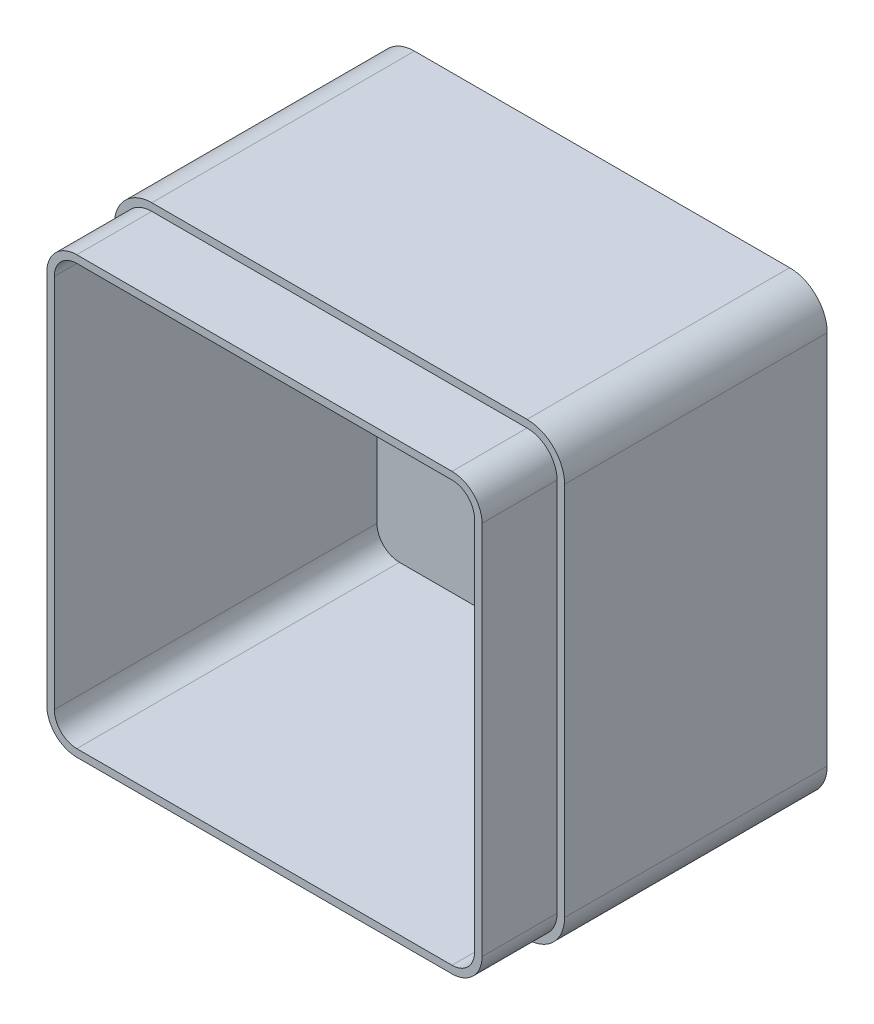
ISO-10303-21;
HEADER;
FILE_DESCRIPTION(('STEP AP214'),'2;1');
FILE_NAME('part.step','',(''),(''),'','','');
FILE_SCHEMA(('AUTOMOTIVE_DESIGN { 1 0 10303 214 1 1 1 1 }'));
ENDSEC;
DATA;
#1=APPLICATION_CONTEXT('core data for automotive mechanical design processes');
#2=APPLICATION_PROTOCOL_DEFINITION('international standard','automotive_design',2000,#1);
#3=PRODUCT_CONTEXT('',#1,'mechanical');
#4=PRODUCT('Part','Part','',(#3));
#5=PRODUCT_RELATED_PRODUCT_CATEGORY('part','',(#4));
#6=PRODUCT_DEFINITION_FORMATION('','',#4);
#7=PRODUCT_DEFINITION_CONTEXT('part definition',#1,'design');
#8=PRODUCT_DEFINITION('design','',#6,#7);
#9=PRODUCT_DEFINITION_SHAPE('','',#8);
#10=(LENGTH_UNIT() NAMED_UNIT(*) SI_UNIT(.MILLI.,.METRE.));
#11=(NAMED_UNIT(*) PLANE_ANGLE_UNIT() SI_UNIT($,.RADIAN.));
#12=(NAMED_UNIT(*) SI_UNIT($,.STERADIAN.) SOLID_ANGLE_UNIT());
#13=UNCERTAINTY_MEASURE_WITH_UNIT(LENGTH_MEASURE(1.E-05),#10,'distance_accuracy_value','');
#14=(GEOMETRIC_REPRESENTATION_CONTEXT(3) GLOBAL_UNCERTAINTY_ASSIGNED_CONTEXT((#13)) GLOBAL_UNIT_ASSIGNED_CONTEXT((#10,
#11,#12)) REPRESENTATION_CONTEXT('',''));
#15=CARTESIAN_POINT('',(0.,0.,0.));
#16=DIRECTION('',(0.,0.,1.));
#17=DIRECTION('',(1.,0.,0.));
#18=AXIS2_PLACEMENT_3D('',#15,#16,#17);
#19=CARTESIAN_POINT('',(0.,0.,90.));
#20=DIRECTION('',(0.,0.,1.));
#21=DIRECTION('',(1.,0.,0.));
#22=AXIS2_PLACEMENT_3D('',#19,#20,#21);
#23=PLANE('',#22);
#24=DIRECTION('',(0.,-1.,0.));
#25=VECTOR('',#24,1.);
#26=CARTESIAN_POINT('',(-42.1774744027304,31.2286689419795,90.));
#27=LINE('',#26,#25);
#28=CARTESIAN_POINT('',(-42.1774744027304,21.2286689419795,90.));
#29=VERTEX_POINT('',#28);
#30=CARTESIAN_POINT('',(-42.1774744027304,-78.7713310580205,90.));
#31=VERTEX_POINT('',#30);
#32=EDGE_CURVE('E318',#29,#31,#27,.T.);
#33=ORIENTED_EDGE('',*,*,#32,.F.);
#34=CARTESIAN_POINT('',(-36.1774744027304,21.2286689419795,90.));
#35=DIRECTION('',(0.,0.,1.));
#36=DIRECTION('',(1.,0.,0.));
#37=AXIS2_PLACEMENT_3D('',#34,#35,#36);
#38=CIRCLE('',#37,6.);
#39=CARTESIAN_POINT('',(-36.1774744027304,27.2286689419795,90.));
#40=VERTEX_POINT('',#39);
#41=EDGE_CURVE('E351',#40,#29,#38,.T.);
#42=ORIENTED_EDGE('',*,*,#41,.F.);
#43=DIRECTION('',(-1.,0.,0.));
#44=VECTOR('',#43,1.);
#45=CARTESIAN_POINT('',(-46.1774744027304,27.2286689419795,90.));
#46=LINE('',#45,#44);
#47=CARTESIAN_POINT('',(63.8225255972696,27.2286689419795,90.));
#48=VERTEX_POINT('',#47);
#49=EDGE_CURVE('E328',#48,#40,#46,.T.);
#50=ORIENTED_EDGE('',*,*,#49,.F.);
#51=CARTESIAN_POINT('',(63.8225255972696,21.2286689419795,90.));
#52=DIRECTION('',(0.,0.,1.));
#53=DIRECTION('',(1.,0.,0.));
#54=AXIS2_PLACEMENT_3D('',#51,#52,#53);
#55=CIRCLE('',#54,6.);
#56=CARTESIAN_POINT('',(69.8225255972696,21.2286689419795,90.));
#57=VERTEX_POINT('',#56);
#58=EDGE_CURVE('E302',#57,#48,#55,.T.);
#59=ORIENTED_EDGE('',*,*,#58,.F.);
#60=DIRECTION('',(0.,1.,0.));
#61=VECTOR('',#60,1.);
#62=CARTESIAN_POINT('',(69.8225255972696,31.2286689419795,90.));
#63=LINE('',#62,#61);
#64=CARTESIAN_POINT('',(69.8225255972696,-78.7713310580205,90.));
#65=VERTEX_POINT('',#64);
#66=EDGE_CURVE('E349',#65,#57,#63,.T.);
#67=ORIENTED_EDGE('',*,*,#66,.F.);
#68=CARTESIAN_POINT('',(63.8225255972696,-78.7713310580205,90.));
#69=DIRECTION('',(0.,0.,1.));
#70=DIRECTION('',(1.,0.,0.));
#71=AXIS2_PLACEMENT_3D('',#68,#69,#70);
#72=CIRCLE('',#71,6.);
#73=CARTESIAN_POINT('',(63.8225255972696,-84.7713310580205,90.));
#74=VERTEX_POINT('',#73);
#75=EDGE_CURVE('E346',#74,#65,#72,.T.);
#76=ORIENTED_EDGE('',*,*,#75,.F.);
#77=DIRECTION('',(1.,0.,0.));
#78=VECTOR('',#77,1.);
#79=CARTESIAN_POINT('',(-46.1774744027304,-84.7713310580205,90.));
#80=LINE('',#79,#78);
#81=CARTESIAN_POINT('',(-36.1774744027304,-84.7713310580205,90.));
#82=VERTEX_POINT('',#81);
#83=EDGE_CURVE('E344',#82,#74,#80,.T.);
#84=ORIENTED_EDGE('',*,*,#83,.F.);
#85=CARTESIAN_POINT('',(-36.1774744027304,-78.7713310580205,90.));
#86=DIRECTION('',(0.,0.,1.));
#87=DIRECTION('',(1.,0.,0.));
#88=AXIS2_PLACEMENT_3D('',#85,#86,#87);
#89=CIRCLE('',#88,6.);
#90=EDGE_CURVE('E335',#31,#82,#89,.T.);
#91=ORIENTED_EDGE('',*,*,#90,.F.);
#92=EDGE_LOOP('',(#33,#42,#50,#59,#67,#76,#84,#91));
#93=FACE_BOUND('',#92,.T.);
#94=DIRECTION('',(-1.,0.,0.));
#95=VECTOR('',#94,1.);
#96=CARTESIAN_POINT('',(63.8225255972696,29.2286689419795,90.));
#97=LINE('',#96,#95);
#98=CARTESIAN_POINT('',(63.8225255972696,29.2286689419795,90.));
#99=VERTEX_POINT('',#98);
#100=CARTESIAN_POINT('',(-36.1774744027304,29.2286689419795,90.));
#101=VERTEX_POINT('',#100);
#102=EDGE_CURVE('E234',#99,#101,#97,.T.);
#103=ORIENTED_EDGE('',*,*,#102,.T.);
#104=CARTESIAN_POINT('',(-36.1774744027304,21.2286689419795,90.));
#105=DIRECTION('',(0.,0.,1.));
#106=DIRECTION('',(1.,0.,0.));
#107=AXIS2_PLACEMENT_3D('',#104,#105,#106);
#108=CIRCLE('',#107,8.);
#109=CARTESIAN_POINT('',(-44.1774744027304,21.2286689419795,90.));
#110=VERTEX_POINT('',#109);
#111=EDGE_CURVE('E254',#101,#110,#108,.T.);
#112=ORIENTED_EDGE('',*,*,#111,.T.);
#113=DIRECTION('',(0.,-1.,0.));
#114=VECTOR('',#113,1.);
#115=CARTESIAN_POINT('',(-44.1774744027304,21.2286689419795,90.));
#116=LINE('',#115,#114);
#117=CARTESIAN_POINT('',(-44.1774744027304,-78.7713310580205,90.));
#118=VERTEX_POINT('',#117);
#119=EDGE_CURVE('E214',#110,#118,#116,.T.);
#120=ORIENTED_EDGE('',*,*,#119,.T.);
#121=CARTESIAN_POINT('',(-36.1774744027304,-78.7713310580205,90.));
#122=DIRECTION('',(0.,0.,1.));
#123=DIRECTION('',(1.,0.,0.));
#124=AXIS2_PLACEMENT_3D('',#121,#122,#123);
#125=CIRCLE('',#124,8.);
#126=CARTESIAN_POINT('',(-36.1774744027304,-86.7713310580205,90.));
#127=VERTEX_POINT('',#126);
#128=EDGE_CURVE('E62',#118,#127,#125,.T.);
#129=ORIENTED_EDGE('',*,*,#128,.T.);
#130=DIRECTION('',(1.,0.,0.));
#131=VECTOR('',#130,1.);
#132=CARTESIAN_POINT('',(-36.1774744027304,-86.7713310580205,90.));
#133=LINE('',#132,#131);
#134=CARTESIAN_POINT('',(63.8225255972696,-86.7713310580205,90.));
#135=VERTEX_POINT('',#134);
#136=EDGE_CURVE('E258',#127,#135,#133,.T.);
#137=ORIENTED_EDGE('',*,*,#136,.T.);
#138=CARTESIAN_POINT('',(63.8225255972696,-78.7713310580205,90.));
#139=DIRECTION('',(0.,0.,1.));
#140=DIRECTION('',(1.,0.,0.));
#141=AXIS2_PLACEMENT_3D('',#138,#139,#140);
#142=CIRCLE('',#141,7.99999999999999);
#143=CARTESIAN_POINT('',(71.8225255972696,-78.7713310580205,90.));
#144=VERTEX_POINT('',#143);
#145=EDGE_CURVE('E261',#135,#144,#142,.T.);
#146=ORIENTED_EDGE('',*,*,#145,.T.);
#147=DIRECTION('',(0.,1.,0.));
#148=VECTOR('',#147,1.);
#149=CARTESIAN_POINT('',(71.8225255972696,-78.7713310580205,90.));
#150=LINE('',#149,#148);
#151=CARTESIAN_POINT('',(71.8225255972696,21.2286689419795,90.));
#152=VERTEX_POINT('',#151);
#153=EDGE_CURVE('E264',#144,#152,#150,.T.);
#154=ORIENTED_EDGE('',*,*,#153,.T.);
#155=CARTESIAN_POINT('',(63.8225255972696,21.2286689419795,90.));
#156=DIRECTION('',(0.,0.,1.));
#157=DIRECTION('',(1.,0.,0.));
#158=AXIS2_PLACEMENT_3D('',#155,#156,#157);
#159=CIRCLE('',#158,7.99999999999999);
#160=EDGE_CURVE('E237',#152,#99,#159,.T.);
#161=ORIENTED_EDGE('',*,*,#160,.T.);
#162=EDGE_LOOP('',(#103,#112,#120,#129,#137,#146,#154,#161));
#163=FACE_BOUND('',#162,.T.);
#164=ADVANCED_FACE('F47',(#93,#163),#23,.T.);
#165=CARTESIAN_POINT('',(-42.1774744027304,31.2286689419795,90.));
#166=DIRECTION('',(1.,0.,0.));
#167=DIRECTION('',(0.,1.,0.));
#168=AXIS2_PLACEMENT_3D('',#165,#166,#167);
#169=PLANE('',#168);
#170=DIRECTION('',(0.,-1.,0.));
#171=VECTOR('',#170,1.);
#172=CARTESIAN_POINT('',(-42.1774744027304,31.2286689419795,4.));
#173=LINE('',#172,#171);
#174=CARTESIAN_POINT('',(-42.1774744027304,21.2286689419795,4.));
#175=VERTEX_POINT('',#174);
#176=CARTESIAN_POINT('',(-42.1774744027304,-78.7713310580205,4.));
#177=VERTEX_POINT('',#176);
#178=EDGE_CURVE('E296',#175,#177,#173,.T.);
#179=ORIENTED_EDGE('',*,*,#178,.F.);
#180=DIRECTION('',(0.,0.,1.));
#181=VECTOR('',#180,1.);
#182=CARTESIAN_POINT('',(-42.1774744027304,21.2286689419795,90.));
#183=LINE('',#182,#181);
#184=EDGE_CURVE('E303',#29,#175,#183,.F.);
#185=ORIENTED_EDGE('',*,*,#184,.F.);
#186=ORIENTED_EDGE('',*,*,#32,.T.);
#187=DIRECTION('',(0.,0.,1.));
#188=VECTOR('',#187,1.);
#189=CARTESIAN_POINT('',(-42.1774744027304,-78.7713310580205,90.));
#190=LINE('',#189,#188);
#191=EDGE_CURVE('E300',#177,#31,#190,.T.);
#192=ORIENTED_EDGE('',*,*,#191,.F.);
#193=EDGE_LOOP('',(#179,#185,#186,#192));
#194=FACE_BOUND('',#193,.T.);
#195=ADVANCED_FACE('F440',(#194),#169,.T.);
#196=CARTESIAN_POINT('',(-46.1774744027304,-84.7713310580205,90.));
#197=DIRECTION('',(0.,1.,0.));
#198=DIRECTION('',(0.,0.,1.));
#199=AXIS2_PLACEMENT_3D('',#196,#197,#198);
#200=PLANE('',#199);
#201=ORIENTED_EDGE('',*,*,#83,.T.);
#202=DIRECTION('',(0.,0.,1.));
#203=VECTOR('',#202,1.);
#204=CARTESIAN_POINT('',(63.8225255972696,-84.7713310580205,90.));
#205=LINE('',#204,#203);
#206=CARTESIAN_POINT('',(63.8225255972696,-84.7713310580205,4.));
#207=VERTEX_POINT('',#206);
#208=EDGE_CURVE('E326',#207,#74,#205,.T.);
#209=ORIENTED_EDGE('',*,*,#208,.F.);
#210=DIRECTION('',(1.,0.,0.));
#211=VECTOR('',#210,1.);
#212=CARTESIAN_POINT('',(-46.1774744027304,-84.7713310580205,4.));
#213=LINE('',#212,#211);
#214=CARTESIAN_POINT('',(-36.1774744027304,-84.7713310580205,4.));
#215=VERTEX_POINT('',#214);
#216=EDGE_CURVE('E299',#215,#207,#213,.T.);
#217=ORIENTED_EDGE('',*,*,#216,.F.);
#218=DIRECTION('',(0.,0.,1.));
#219=VECTOR('',#218,1.);
#220=CARTESIAN_POINT('',(-36.1774744027304,-84.7713310580205,90.));
#221=LINE('',#220,#219);
#222=EDGE_CURVE('E320',#82,#215,#221,.F.);
#223=ORIENTED_EDGE('',*,*,#222,.F.);
#224=EDGE_LOOP('',(#201,#209,#217,#223));
#225=FACE_BOUND('',#224,.T.);
#226=ADVANCED_FACE('F448',(#225),#200,.T.);
#227=CARTESIAN_POINT('',(69.8225255972696,31.2286689419795,90.));
#228=DIRECTION('',(-1.,0.,0.));
#229=DIRECTION('',(0.,0.,1.));
#230=AXIS2_PLACEMENT_3D('',#227,#228,#229);
#231=PLANE('',#230);
#232=ORIENTED_EDGE('',*,*,#66,.T.);
#233=DIRECTION('',(0.,0.,1.));
#234=VECTOR('',#233,1.);
#235=CARTESIAN_POINT('',(69.8225255972696,21.2286689419795,90.));
#236=LINE('',#235,#234);
#237=CARTESIAN_POINT('',(69.8225255972696,21.2286689419795,4.));
#238=VERTEX_POINT('',#237);
#239=EDGE_CURVE('E333',#238,#57,#236,.T.);
#240=ORIENTED_EDGE('',*,*,#239,.F.);
#241=DIRECTION('',(0.,1.,0.));
#242=VECTOR('',#241,1.);
#243=CARTESIAN_POINT('',(69.8225255972696,31.2286689419795,4.));
#244=LINE('',#243,#242);
#245=CARTESIAN_POINT('',(69.8225255972696,-78.7713310580205,4.));
#246=VERTEX_POINT('',#245);
#247=EDGE_CURVE('E309',#246,#238,#244,.T.);
#248=ORIENTED_EDGE('',*,*,#247,.F.);
#249=DIRECTION('',(0.,0.,1.));
#250=VECTOR('',#249,1.);
#251=CARTESIAN_POINT('',(69.8225255972696,-78.7713310580205,90.));
#252=LINE('',#251,#250);
#253=EDGE_CURVE('E329',#65,#246,#252,.F.);
#254=ORIENTED_EDGE('',*,*,#253,.F.);
#255=EDGE_LOOP('',(#232,#240,#248,#254));
#256=FACE_BOUND('',#255,.T.);
#257=ADVANCED_FACE('F567',(#256),#231,.T.);
#258=CARTESIAN_POINT('',(-46.1774744027304,27.2286689419795,90.));
#259=DIRECTION('',(0.,-1.,0.));
#260=DIRECTION('',(0.,0.,-1.));
#261=AXIS2_PLACEMENT_3D('',#258,#259,#260);
#262=PLANE('',#261);
#263=DIRECTION('',(-1.,0.,0.));
#264=VECTOR('',#263,1.);
#265=CARTESIAN_POINT('',(-46.1774744027304,27.2286689419795,4.));
#266=LINE('',#265,#264);
#267=CARTESIAN_POINT('',(63.8225255972696,27.2286689419795,4.));
#268=VERTEX_POINT('',#267);
#269=CARTESIAN_POINT('',(-36.1774744027304,27.2286689419795,4.));
#270=VERTEX_POINT('',#269);
#271=EDGE_CURVE('E315',#268,#270,#266,.T.);
#272=ORIENTED_EDGE('',*,*,#271,.F.);
#273=DIRECTION('',(0.,0.,-1.));
#274=VECTOR('',#273,1.);
#275=CARTESIAN_POINT('',(63.8225255972696,27.2286689419795,90.));
#276=LINE('',#275,#274);
#277=EDGE_CURVE('E332',#48,#268,#276,.T.);
#278=ORIENTED_EDGE('',*,*,#277,.F.);
#279=ORIENTED_EDGE('',*,*,#49,.T.);
#280=DIRECTION('',(0.,0.,-1.));
#281=VECTOR('',#280,1.);
#282=CARTESIAN_POINT('',(-36.1774744027304,27.2286689419795,90.));
#283=LINE('',#282,#281);
#284=EDGE_CURVE('E338',#270,#40,#283,.F.);
#285=ORIENTED_EDGE('',*,*,#284,.F.);
#286=EDGE_LOOP('',(#272,#278,#279,#285));
#287=FACE_BOUND('',#286,.T.);
#288=ADVANCED_FACE('F571',(#287),#262,.T.);
#289=CARTESIAN_POINT('',(0.,0.,4.));
#290=DIRECTION('',(0.,0.,1.));
#291=DIRECTION('',(1.,0.,0.));
#292=AXIS2_PLACEMENT_3D('',#289,#290,#291);
#293=PLANE('',#292);
#294=ORIENTED_EDGE('',*,*,#216,.T.);
#295=CARTESIAN_POINT('',(63.8225255972696,-78.7713310580205,4.));
#296=DIRECTION('',(0.,0.,1.));
#297=DIRECTION('',(1.,0.,0.));
#298=AXIS2_PLACEMENT_3D('',#295,#296,#297);
#299=CIRCLE('',#298,6.);
#300=EDGE_CURVE('E311',#246,#207,#299,.F.);
#301=ORIENTED_EDGE('',*,*,#300,.F.);
#302=ORIENTED_EDGE('',*,*,#247,.T.);
#303=CARTESIAN_POINT('',(63.8225255972696,21.2286689419795,4.));
#304=DIRECTION('',(0.,0.,1.));
#305=DIRECTION('',(1.,0.,0.));
#306=AXIS2_PLACEMENT_3D('',#303,#304,#305);
#307=CIRCLE('',#306,6.);
#308=EDGE_CURVE('E314',#268,#238,#307,.F.);
#309=ORIENTED_EDGE('',*,*,#308,.F.);
#310=ORIENTED_EDGE('',*,*,#271,.T.);
#311=CARTESIAN_POINT('',(-36.1774744027304,21.2286689419795,4.));
#312=DIRECTION('',(0.,0.,1.));
#313=DIRECTION('',(1.,0.,0.));
#314=AXIS2_PLACEMENT_3D('',#311,#312,#313);
#315=CIRCLE('',#314,6.);
#316=EDGE_CURVE('E312',#175,#270,#315,.F.);
#317=ORIENTED_EDGE('',*,*,#316,.F.);
#318=ORIENTED_EDGE('',*,*,#178,.T.);
#319=CARTESIAN_POINT('',(-36.1774744027304,-78.7713310580205,4.));
#320=DIRECTION('',(0.,0.,1.));
#321=DIRECTION('',(1.,0.,0.));
#322=AXIS2_PLACEMENT_3D('',#319,#320,#321);
#323=CIRCLE('',#322,6.);
#324=EDGE_CURVE('E306',#215,#177,#323,.F.);
#325=ORIENTED_EDGE('',*,*,#324,.F.);
#326=EDGE_LOOP('',(#294,#301,#302,#309,#310,#317,#318,#325));
#327=FACE_BOUND('',#326,.T.);
#328=ADVANCED_FACE('F575',(#327),#293,.T.);
#329=CARTESIAN_POINT('',(-36.1774744027304,-78.7713310580205,90.));
#330=DIRECTION('',(0.,0.,-1.));
#331=DIRECTION('',(-1.,0.,0.));
#332=AXIS2_PLACEMENT_3D('',#329,#330,#331);
#333=CYLINDRICAL_SURFACE('',#332,6.);
#334=ORIENTED_EDGE('',*,*,#90,.T.);
#335=ORIENTED_EDGE('',*,*,#222,.T.);
#336=ORIENTED_EDGE('',*,*,#324,.T.);
#337=ORIENTED_EDGE('',*,*,#191,.T.);
#338=EDGE_LOOP('',(#334,#335,#336,#337));
#339=FACE_BOUND('',#338,.T.);
#340=ADVANCED_FACE('F579',(#339),#333,.F.);
#341=CARTESIAN_POINT('',(63.8225255972696,-78.7713310580205,90.));
#342=DIRECTION('',(0.,0.,-1.));
#343=DIRECTION('',(-1.,0.,0.));
#344=AXIS2_PLACEMENT_3D('',#341,#342,#343);
#345=CYLINDRICAL_SURFACE('',#344,6.);
#346=ORIENTED_EDGE('',*,*,#75,.T.);
#347=ORIENTED_EDGE('',*,*,#253,.T.);
#348=ORIENTED_EDGE('',*,*,#300,.T.);
#349=ORIENTED_EDGE('',*,*,#208,.T.);
#350=EDGE_LOOP('',(#346,#347,#348,#349));
#351=FACE_BOUND('',#350,.T.);
#352=ADVANCED_FACE('F583',(#351),#345,.F.);
#353=CARTESIAN_POINT('',(-36.1774744027304,21.2286689419795,90.));
#354=DIRECTION('',(0.,0.,-1.));
#355=DIRECTION('',(-1.,0.,0.));
#356=AXIS2_PLACEMENT_3D('',#353,#354,#355);
#357=CYLINDRICAL_SURFACE('',#356,6.);
#358=ORIENTED_EDGE('',*,*,#41,.T.);
#359=ORIENTED_EDGE('',*,*,#184,.T.);
#360=ORIENTED_EDGE('',*,*,#316,.T.);
#361=ORIENTED_EDGE('',*,*,#284,.T.);
#362=EDGE_LOOP('',(#358,#359,#360,#361));
#363=FACE_BOUND('',#362,.T.);
#364=ADVANCED_FACE('F586',(#363),#357,.F.);
#365=CARTESIAN_POINT('',(63.8225255972696,21.2286689419795,90.));
#366=DIRECTION('',(0.,0.,-1.));
#367=DIRECTION('',(-1.,0.,0.));
#368=AXIS2_PLACEMENT_3D('',#365,#366,#367);
#369=CYLINDRICAL_SURFACE('',#368,6.);
#370=ORIENTED_EDGE('',*,*,#58,.T.);
#371=ORIENTED_EDGE('',*,*,#277,.T.);
#372=ORIENTED_EDGE('',*,*,#308,.T.);
#373=ORIENTED_EDGE('',*,*,#239,.T.);
#374=EDGE_LOOP('',(#370,#371,#372,#373));
#375=FACE_BOUND('',#374,.T.);
#376=ADVANCED_FACE('F455',(#375),#369,.F.);
#377=CARTESIAN_POINT('',(-36.1774744027304,21.2286689419795,70.));
#378=DIRECTION('',(0.,0.,1.));
#379=DIRECTION('',(1.,0.,0.));
#380=AXIS2_PLACEMENT_3D('',#377,#378,#379);
#381=PLANE('',#380);
#382=DIRECTION('',(-1.,0.,0.));
#383=VECTOR('',#382,1.);
#384=CARTESIAN_POINT('',(63.8225255972696,29.2286689419795,70.));
#385=LINE('',#384,#383);
#386=CARTESIAN_POINT('',(63.8225255972696,29.2286689419795,70.));
#387=VERTEX_POINT('',#386);
#388=CARTESIAN_POINT('',(-36.1774744027304,29.2286689419795,70.));
#389=VERTEX_POINT('',#388);
#390=EDGE_CURVE('E220',#387,#389,#385,.T.);
#391=ORIENTED_EDGE('',*,*,#390,.F.);
#392=CARTESIAN_POINT('',(63.8225255972696,21.2286689419795,70.));
#393=DIRECTION('',(0.,0.,1.));
#394=DIRECTION('',(1.,0.,0.));
#395=AXIS2_PLACEMENT_3D('',#392,#393,#394);
#396=CIRCLE('',#395,7.99999999999999);
#397=CARTESIAN_POINT('',(71.8225255972696,21.2286689419795,70.));
#398=VERTEX_POINT('',#397);
#399=EDGE_CURVE('E250',#398,#387,#396,.T.);
#400=ORIENTED_EDGE('',*,*,#399,.F.);
#401=DIRECTION('',(0.,1.,0.));
#402=VECTOR('',#401,1.);
#403=CARTESIAN_POINT('',(71.8225255972696,-78.7713310580205,70.));
#404=LINE('',#403,#402);
#405=CARTESIAN_POINT('',(71.8225255972696,-78.7713310580205,70.));
#406=VERTEX_POINT('',#405);
#407=EDGE_CURVE('E247',#406,#398,#404,.T.);
#408=ORIENTED_EDGE('',*,*,#407,.F.);
#409=CARTESIAN_POINT('',(63.8225255972696,-78.7713310580205,70.));
#410=DIRECTION('',(0.,0.,1.));
#411=DIRECTION('',(1.,0.,0.));
#412=AXIS2_PLACEMENT_3D('',#409,#410,#411);
#413=CIRCLE('',#412,7.99999999999999);
#414=CARTESIAN_POINT('',(63.8225255972696,-86.7713310580205,70.));
#415=VERTEX_POINT('',#414);
#416=EDGE_CURVE('E244',#415,#406,#413,.T.);
#417=ORIENTED_EDGE('',*,*,#416,.F.);
#418=DIRECTION('',(1.,0.,0.));
#419=VECTOR('',#418,1.);
#420=CARTESIAN_POINT('',(-36.1774744027304,-86.7713310580205,70.));
#421=LINE('',#420,#419);
#422=CARTESIAN_POINT('',(-36.1774744027304,-86.7713310580205,70.));
#423=VERTEX_POINT('',#422);
#424=EDGE_CURVE('E241',#423,#415,#421,.T.);
#425=ORIENTED_EDGE('',*,*,#424,.F.);
#426=CARTESIAN_POINT('',(-36.1774744027304,-78.7713310580205,70.));
#427=DIRECTION('',(0.,0.,1.));
#428=DIRECTION('',(1.,0.,0.));
#429=AXIS2_PLACEMENT_3D('',#426,#427,#428);
#430=CIRCLE('',#429,8.);
#431=CARTESIAN_POINT('',(-44.1774744027304,-78.7713310580205,70.));
#432=VERTEX_POINT('',#431);
#433=EDGE_CURVE('E230',#432,#423,#430,.T.);
#434=ORIENTED_EDGE('',*,*,#433,.F.);
#435=DIRECTION('',(0.,-1.,0.));
#436=VECTOR('',#435,1.);
#437=CARTESIAN_POINT('',(-44.1774744027304,21.2286689419795,70.));
#438=LINE('',#437,#436);
#439=CARTESIAN_POINT('',(-44.1774744027304,21.2286689419795,70.));
#440=VERTEX_POINT('',#439);
#441=EDGE_CURVE('E212',#440,#432,#438,.T.);
#442=ORIENTED_EDGE('',*,*,#441,.F.);
#443=CARTESIAN_POINT('',(-36.1774744027304,21.2286689419795,70.));
#444=DIRECTION('',(0.,0.,1.));
#445=DIRECTION('',(1.,0.,0.));
#446=AXIS2_PLACEMENT_3D('',#443,#444,#445);
#447=CIRCLE('',#446,8.);
#448=EDGE_CURVE('E226',#389,#440,#447,.T.);
#449=ORIENTED_EDGE('',*,*,#448,.F.);
#450=EDGE_LOOP('',(#391,#400,#408,#417,#425,#434,#442,#449));
#451=FACE_BOUND('',#450,.T.);
#452=CARTESIAN_POINT('',(-36.1774744027304,21.2286689419795,70.));
#453=DIRECTION('',(0.,0.,1.));
#454=DIRECTION('',(1.,0.,0.));
#455=AXIS2_PLACEMENT_3D('',#452,#453,#454);
#456=CIRCLE('',#455,10.);
#457=CARTESIAN_POINT('',(-36.1774744027304,31.2286689419795,70.));
#458=VERTEX_POINT('',#457);
#459=CARTESIAN_POINT('',(-46.1774744027304,21.2286689419795,70.));
#460=VERTEX_POINT('',#459);
#461=EDGE_CURVE('E270',#458,#460,#456,.T.);
#462=ORIENTED_EDGE('',*,*,#461,.T.);
#463=DIRECTION('',(0.,-1.,0.));
#464=VECTOR('',#463,1.);
#465=CARTESIAN_POINT('',(-46.1774744027304,21.2286689419795,70.));
#466=LINE('',#465,#464);
#467=CARTESIAN_POINT('',(-46.1774744027304,-78.7713310580205,70.));
#468=VERTEX_POINT('',#467);
#469=EDGE_CURVE('E283',#460,#468,#466,.T.);
#470=ORIENTED_EDGE('',*,*,#469,.T.);
#471=CARTESIAN_POINT('',(-36.1774744027304,-78.7713310580205,70.));
#472=DIRECTION('',(0.,0.,1.));
#473=DIRECTION('',(1.,0.,0.));
#474=AXIS2_PLACEMENT_3D('',#471,#472,#473);
#475=CIRCLE('',#474,10.);
#476=CARTESIAN_POINT('',(-36.1774744027304,-88.7713310580205,70.));
#477=VERTEX_POINT('',#476);
#478=EDGE_CURVE('E285',#468,#477,#475,.T.);
#479=ORIENTED_EDGE('',*,*,#478,.T.);
#480=DIRECTION('',(1.,0.,0.));
#481=VECTOR('',#480,1.);
#482=CARTESIAN_POINT('',(-36.1774744027304,-88.7713310580205,70.));
#483=LINE('',#482,#481);
#484=CARTESIAN_POINT('',(63.8225255972696,-88.7713310580205,70.));
#485=VERTEX_POINT('',#484);
#486=EDGE_CURVE('E287',#477,#485,#483,.T.);
#487=ORIENTED_EDGE('',*,*,#486,.T.);
#488=CARTESIAN_POINT('',(63.8225255972696,-78.7713310580205,70.));
#489=DIRECTION('',(0.,0.,1.));
#490=DIRECTION('',(1.,0.,0.));
#491=AXIS2_PLACEMENT_3D('',#488,#489,#490);
#492=CIRCLE('',#491,9.99999999999999);
#493=CARTESIAN_POINT('',(73.8225255972696,-78.7713310580205,70.));
#494=VERTEX_POINT('',#493);
#495=EDGE_CURVE('E289',#485,#494,#492,.T.);
#496=ORIENTED_EDGE('',*,*,#495,.T.);
#497=DIRECTION('',(0.,1.,0.));
#498=VECTOR('',#497,1.);
#499=CARTESIAN_POINT('',(73.8225255972696,-78.7713310580205,70.));
#500=LINE('',#499,#498);
#501=CARTESIAN_POINT('',(73.8225255972696,21.2286689419795,70.));
#502=VERTEX_POINT('',#501);
#503=EDGE_CURVE('E70',#494,#502,#500,.T.);
#504=ORIENTED_EDGE('',*,*,#503,.T.);
#505=CARTESIAN_POINT('',(63.8225255972696,21.2286689419795,70.));
#506=DIRECTION('',(0.,0.,1.));
#507=DIRECTION('',(1.,0.,0.));
#508=AXIS2_PLACEMENT_3D('',#505,#506,#507);
#509=CIRCLE('',#508,9.99999999999999);
#510=CARTESIAN_POINT('',(63.8225255972696,31.2286689419795,70.));
#511=VERTEX_POINT('',#510);
#512=EDGE_CURVE('E292',#502,#511,#509,.T.);
#513=ORIENTED_EDGE('',*,*,#512,.T.);
#514=DIRECTION('',(-1.,0.,0.));
#515=VECTOR('',#514,1.);
#516=CARTESIAN_POINT('',(63.8225255972696,31.2286689419795,70.));
#517=LINE('',#516,#515);
#518=EDGE_CURVE('E294',#511,#458,#517,.T.);
#519=ORIENTED_EDGE('',*,*,#518,.T.);
#520=EDGE_LOOP('',(#462,#470,#479,#487,#496,#504,#513,#519));
#521=FACE_BOUND('',#520,.T.);
#522=ADVANCED_FACE('F225',(#451,#521),#381,.T.);
#523=CARTESIAN_POINT('',(-36.1774744027304,21.2286689419795,70.));
#524=DIRECTION('',(0.,0.,1.));
#525=DIRECTION('',(1.,0.,0.));
#526=AXIS2_PLACEMENT_3D('',#523,#524,#525);
#527=CYLINDRICAL_SURFACE('',#526,8.);
#528=ORIENTED_EDGE('',*,*,#111,.F.);
#529=DIRECTION('',(0.,0.,1.));
#530=VECTOR('',#529,1.);
#531=CARTESIAN_POINT('',(-36.1774744027304,29.2286689419795,70.));
#532=LINE('',#531,#530);
#533=EDGE_CURVE('E233',#389,#101,#532,.T.);
#534=ORIENTED_EDGE('',*,*,#533,.F.);
#535=ORIENTED_EDGE('',*,*,#448,.T.);
#536=DIRECTION('',(0.,0.,1.));
#537=VECTOR('',#536,1.);
#538=CARTESIAN_POINT('',(-44.1774744027304,21.2286689419795,70.));
#539=LINE('',#538,#537);
#540=EDGE_CURVE('E209',#440,#110,#539,.T.);
#541=ORIENTED_EDGE('',*,*,#540,.T.);
#542=EDGE_LOOP('',(#528,#534,#535,#541));
#543=FACE_BOUND('',#542,.T.);
#544=ADVANCED_FACE('F232',(#543),#527,.T.);
#545=CARTESIAN_POINT('',(63.8225255972696,29.2286689419795,70.));
#546=DIRECTION('',(0.,1.,0.));
#547=DIRECTION('',(-1.,0.,0.));
#548=AXIS2_PLACEMENT_3D('',#545,#546,#547);
#549=PLANE('',#548);
#550=ORIENTED_EDGE('',*,*,#102,.F.);
#551=DIRECTION('',(0.,0.,1.));
#552=VECTOR('',#551,1.);
#553=CARTESIAN_POINT('',(63.8225255972696,29.2286689419795,70.));
#554=LINE('',#553,#552);
#555=EDGE_CURVE('E271',#387,#99,#554,.T.);
#556=ORIENTED_EDGE('',*,*,#555,.F.);
#557=ORIENTED_EDGE('',*,*,#390,.T.);
#558=ORIENTED_EDGE('',*,*,#533,.T.);
#559=EDGE_LOOP('',(#550,#556,#557,#558));
#560=FACE_BOUND('',#559,.T.);
#561=ADVANCED_FACE('F494',(#560),#549,.T.);
#562=CARTESIAN_POINT('',(63.8225255972696,21.2286689419795,70.));
#563=DIRECTION('',(0.,0.,1.));
#564=DIRECTION('',(1.,0.,0.));
#565=AXIS2_PLACEMENT_3D('',#562,#563,#564);
#566=CYLINDRICAL_SURFACE('',#565,7.99999999999999);
#567=ORIENTED_EDGE('',*,*,#160,.F.);
#568=DIRECTION('',(0.,0.,1.));
#569=VECTOR('',#568,1.);
#570=CARTESIAN_POINT('',(71.8225255972696,21.2286689419795,70.));
#571=LINE('',#570,#569);
#572=EDGE_CURVE('E273',#398,#152,#571,.T.);
#573=ORIENTED_EDGE('',*,*,#572,.F.);
#574=ORIENTED_EDGE('',*,*,#399,.T.);
#575=ORIENTED_EDGE('',*,*,#555,.T.);
#576=EDGE_LOOP('',(#567,#573,#574,#575));
#577=FACE_BOUND('',#576,.T.);
#578=ADVANCED_FACE('F502',(#577),#566,.T.);
#579=CARTESIAN_POINT('',(71.8225255972696,-78.7713310580205,70.));
#580=DIRECTION('',(1.,0.,0.));
#581=DIRECTION('',(0.,0.,-1.));
#582=AXIS2_PLACEMENT_3D('',#579,#580,#581);
#583=PLANE('',#582);
#584=ORIENTED_EDGE('',*,*,#153,.F.);
#585=DIRECTION('',(0.,0.,1.));
#586=VECTOR('',#585,1.);
#587=CARTESIAN_POINT('',(71.8225255972696,-78.7713310580205,70.));
#588=LINE('',#587,#586);
#589=EDGE_CURVE('E275',#406,#144,#588,.T.);
#590=ORIENTED_EDGE('',*,*,#589,.F.);
#591=ORIENTED_EDGE('',*,*,#407,.T.);
#592=ORIENTED_EDGE('',*,*,#572,.T.);
#593=EDGE_LOOP('',(#584,#590,#591,#592));
#594=FACE_BOUND('',#593,.T.);
#595=ADVANCED_FACE('F511',(#594),#583,.T.);
#596=CARTESIAN_POINT('',(63.8225255972696,-78.7713310580205,70.));
#597=DIRECTION('',(0.,0.,1.));
#598=DIRECTION('',(1.,0.,0.));
#599=AXIS2_PLACEMENT_3D('',#596,#597,#598);
#600=CYLINDRICAL_SURFACE('',#599,7.99999999999999);
#601=ORIENTED_EDGE('',*,*,#145,.F.);
#602=DIRECTION('',(0.,0.,1.));
#603=VECTOR('',#602,1.);
#604=CARTESIAN_POINT('',(63.8225255972696,-86.7713310580205,70.));
#605=LINE('',#604,#603);
#606=EDGE_CURVE('E277',#415,#135,#605,.T.);
#607=ORIENTED_EDGE('',*,*,#606,.F.);
#608=ORIENTED_EDGE('',*,*,#416,.T.);
#609=ORIENTED_EDGE('',*,*,#589,.T.);
#610=EDGE_LOOP('',(#601,#607,#608,#609));
#611=FACE_BOUND('',#610,.T.);
#612=ADVANCED_FACE('F520',(#611),#600,.T.);
#613=CARTESIAN_POINT('',(-36.1774744027304,-86.7713310580205,70.));
#614=DIRECTION('',(0.,-1.,0.));
#615=DIRECTION('',(0.,0.,-1.));
#616=AXIS2_PLACEMENT_3D('',#613,#614,#615);
#617=PLANE('',#616);
#618=ORIENTED_EDGE('',*,*,#136,.F.);
#619=DIRECTION('',(0.,0.,1.));
#620=VECTOR('',#619,1.);
#621=CARTESIAN_POINT('',(-36.1774744027304,-86.7713310580205,70.));
#622=LINE('',#621,#620);
#623=EDGE_CURVE('E279',#423,#127,#622,.T.);
#624=ORIENTED_EDGE('',*,*,#623,.F.);
#625=ORIENTED_EDGE('',*,*,#424,.T.);
#626=ORIENTED_EDGE('',*,*,#606,.T.);
#627=EDGE_LOOP('',(#618,#624,#625,#626));
#628=FACE_BOUND('',#627,.T.);
#629=ADVANCED_FACE('F529',(#628),#617,.T.);
#630=CARTESIAN_POINT('',(-36.1774744027304,-78.7713310580205,70.));
#631=DIRECTION('',(0.,0.,1.));
#632=DIRECTION('',(1.,0.,0.));
#633=AXIS2_PLACEMENT_3D('',#630,#631,#632);
#634=CYLINDRICAL_SURFACE('',#633,8.);
#635=ORIENTED_EDGE('',*,*,#128,.F.);
#636=DIRECTION('',(0.,0.,1.));
#637=VECTOR('',#636,1.);
#638=CARTESIAN_POINT('',(-44.1774744027304,-78.7713310580205,70.));
#639=LINE('',#638,#637);
#640=EDGE_CURVE('E219',#432,#118,#639,.T.);
#641=ORIENTED_EDGE('',*,*,#640,.F.);
#642=ORIENTED_EDGE('',*,*,#433,.T.);
#643=ORIENTED_EDGE('',*,*,#623,.T.);
#644=EDGE_LOOP('',(#635,#641,#642,#643));
#645=FACE_BOUND('',#644,.T.);
#646=ADVANCED_FACE('F538',(#645),#634,.T.);
#647=CARTESIAN_POINT('',(-44.1774744027304,21.2286689419795,70.));
#648=DIRECTION('',(-1.,0.,0.));
#649=DIRECTION('',(0.,0.,1.));
#650=AXIS2_PLACEMENT_3D('',#647,#648,#649);
#651=PLANE('',#650);
#652=ORIENTED_EDGE('',*,*,#119,.F.);
#653=ORIENTED_EDGE('',*,*,#540,.F.);
#654=ORIENTED_EDGE('',*,*,#441,.T.);
#655=ORIENTED_EDGE('',*,*,#640,.T.);
#656=EDGE_LOOP('',(#652,#653,#654,#655));
#657=FACE_BOUND('',#656,.T.);
#658=ADVANCED_FACE('F211',(#657),#651,.T.);
#659=CARTESIAN_POINT('',(0.,0.,0.));
#660=DIRECTION('',(0.,0.,1.));
#661=DIRECTION('',(1.,0.,0.));
#662=AXIS2_PLACEMENT_3D('',#659,#660,#661);
#663=PLANE('',#662);
#664=DIRECTION('',(1.,0.,0.));
#665=VECTOR('',#664,1.);
#666=CARTESIAN_POINT('',(-46.1774744027304,-88.7713310580205,0.));
#667=LINE('',#666,#665);
#668=CARTESIAN_POINT('',(-36.1774744027304,-88.7713310580205,0.));
#669=VERTEX_POINT('',#668);
#670=CARTESIAN_POINT('',(63.8225255972696,-88.7713310580205,0.));
#671=VERTEX_POINT('',#670);
#672=EDGE_CURVE('E359',#669,#671,#667,.T.);
#673=ORIENTED_EDGE('',*,*,#672,.F.);
#674=CARTESIAN_POINT('',(-36.1774744027304,-78.7713310580205,0.));
#675=DIRECTION('',(0.,0.,1.));
#676=DIRECTION('',(1.,0.,0.));
#677=AXIS2_PLACEMENT_3D('',#674,#675,#676);
#678=CIRCLE('',#677,10.);
#679=CARTESIAN_POINT('',(-46.1774744027304,-78.7713310580205,0.));
#680=VERTEX_POINT('',#679);
#681=EDGE_CURVE('E379',#669,#680,#678,.F.);
#682=ORIENTED_EDGE('',*,*,#681,.T.);
#683=DIRECTION('',(0.,-1.,0.));
#684=VECTOR('',#683,1.);
#685=CARTESIAN_POINT('',(-46.1774744027304,31.2286689419795,0.));
#686=LINE('',#685,#684);
#687=CARTESIAN_POINT('',(-46.1774744027304,21.2286689419795,0.));
#688=VERTEX_POINT('',#687);
#689=EDGE_CURVE('E341',#688,#680,#686,.T.);
#690=ORIENTED_EDGE('',*,*,#689,.F.);
#691=CARTESIAN_POINT('',(-36.1774744027304,21.2286689419795,0.));
#692=DIRECTION('',(0.,0.,1.));
#693=DIRECTION('',(1.,0.,0.));
#694=AXIS2_PLACEMENT_3D('',#691,#692,#693);
#695=CIRCLE('',#694,10.);
#696=CARTESIAN_POINT('',(-36.1774744027304,31.2286689419795,0.));
#697=VERTEX_POINT('',#696);
#698=EDGE_CURVE('E375',#688,#697,#695,.F.);
#699=ORIENTED_EDGE('',*,*,#698,.T.);
#700=DIRECTION('',(-1.,0.,0.));
#701=VECTOR('',#700,1.);
#702=CARTESIAN_POINT('',(-46.1774744027304,31.2286689419795,0.));
#703=LINE('',#702,#701);
#704=CARTESIAN_POINT('',(63.8225255972696,31.2286689419795,0.));
#705=VERTEX_POINT('',#704);
#706=EDGE_CURVE('E365',#705,#697,#703,.T.);
#707=ORIENTED_EDGE('',*,*,#706,.F.);
#708=CARTESIAN_POINT('',(63.8225255972696,21.2286689419795,0.));
#709=DIRECTION('',(0.,0.,1.));
#710=DIRECTION('',(1.,0.,0.));
#711=AXIS2_PLACEMENT_3D('',#708,#709,#710);
#712=CIRCLE('',#711,10.);
#713=CARTESIAN_POINT('',(73.8225255972696,21.2286689419795,0.));
#714=VERTEX_POINT('',#713);
#715=EDGE_CURVE('E373',#705,#714,#712,.F.);
#716=ORIENTED_EDGE('',*,*,#715,.T.);
#717=DIRECTION('',(0.,1.,0.));
#718=VECTOR('',#717,1.);
#719=CARTESIAN_POINT('',(73.8225255972696,31.2286689419795,0.));
#720=LINE('',#719,#718);
#721=CARTESIAN_POINT('',(73.8225255972696,-78.7713310580205,0.));
#722=VERTEX_POINT('',#721);
#723=EDGE_CURVE('E362',#722,#714,#720,.T.);
#724=ORIENTED_EDGE('',*,*,#723,.F.);
#725=CARTESIAN_POINT('',(63.8225255972696,-78.7713310580205,0.));
#726=DIRECTION('',(0.,0.,1.));
#727=DIRECTION('',(1.,0.,0.));
#728=AXIS2_PLACEMENT_3D('',#725,#726,#727);
#729=CIRCLE('',#728,10.);
#730=EDGE_CURVE('E377',#722,#671,#729,.F.);
#731=ORIENTED_EDGE('',*,*,#730,.T.);
#732=EDGE_LOOP('',(#673,#682,#690,#699,#707,#716,#724,#731));
#733=FACE_BOUND('',#732,.T.);
#734=ADVANCED_FACE('F402',(#733),#663,.F.);
#735=CARTESIAN_POINT('',(-36.1774744027304,21.2286689419795,90.));
#736=DIRECTION('',(0.,0.,-1.));
#737=DIRECTION('',(-1.,0.,0.));
#738=AXIS2_PLACEMENT_3D('',#735,#736,#737);
#739=CYLINDRICAL_SURFACE('',#738,10.);
#740=DIRECTION('',(0.,0.,-1.));
#741=VECTOR('',#740,1.);
#742=CARTESIAN_POINT('',(-46.1774744027304,21.2286689419795,90.));
#743=LINE('',#742,#741);
#744=EDGE_CURVE('E381',#460,#688,#743,.T.);
#745=ORIENTED_EDGE('',*,*,#744,.F.);
#746=ORIENTED_EDGE('',*,*,#461,.F.);
#747=DIRECTION('',(0.,0.,-1.));
#748=VECTOR('',#747,1.);
#749=CARTESIAN_POINT('',(-36.1774744027304,31.2286689419795,90.));
#750=LINE('',#749,#748);
#751=EDGE_CURVE('E12',#697,#458,#750,.F.);
#752=ORIENTED_EDGE('',*,*,#751,.F.);
#753=ORIENTED_EDGE('',*,*,#698,.F.);
#754=EDGE_LOOP('',(#745,#746,#752,#753));
#755=FACE_BOUND('',#754,.T.);
#756=ADVANCED_FACE('F407',(#755),#739,.T.);
#757=CARTESIAN_POINT('',(63.8225255972696,21.2286689419795,90.));
#758=DIRECTION('',(0.,0.,-1.));
#759=DIRECTION('',(-1.,0.,0.));
#760=AXIS2_PLACEMENT_3D('',#757,#758,#759);
#761=CYLINDRICAL_SURFACE('',#760,10.);
#762=DIRECTION('',(0.,0.,-1.));
#763=VECTOR('',#762,1.);
#764=CARTESIAN_POINT('',(63.8225255972696,31.2286689419795,90.));
#765=LINE('',#764,#763);
#766=EDGE_CURVE('E55',#511,#705,#765,.T.);
#767=ORIENTED_EDGE('',*,*,#766,.F.);
#768=ORIENTED_EDGE('',*,*,#512,.F.);
#769=DIRECTION('',(0.,0.,-1.));
#770=VECTOR('',#769,1.);
#771=CARTESIAN_POINT('',(73.8225255972696,21.2286689419795,90.));
#772=LINE('',#771,#770);
#773=EDGE_CURVE('E386',#714,#502,#772,.F.);
#774=ORIENTED_EDGE('',*,*,#773,.F.);
#775=ORIENTED_EDGE('',*,*,#715,.F.);
#776=EDGE_LOOP('',(#767,#768,#774,#775));
#777=FACE_BOUND('',#776,.T.);
#778=ADVANCED_FACE('F49',(#777),#761,.T.);
#779=CARTESIAN_POINT('',(-46.1774744027304,31.2286689419795,90.));
#780=DIRECTION('',(0.,-1.,0.));
#781=DIRECTION('',(0.,0.,-1.));
#782=AXIS2_PLACEMENT_3D('',#779,#780,#781);
#783=PLANE('',#782);
#784=ORIENTED_EDGE('',*,*,#518,.F.);
#785=ORIENTED_EDGE('',*,*,#766,.T.);
#786=ORIENTED_EDGE('',*,*,#706,.T.);
#787=ORIENTED_EDGE('',*,*,#751,.T.);
#788=EDGE_LOOP('',(#784,#785,#786,#787));
#789=FACE_BOUND('',#788,.T.);
#790=ADVANCED_FACE('F394',(#789),#783,.F.);
#791=CARTESIAN_POINT('',(63.8225255972696,-78.7713310580205,90.));
#792=DIRECTION('',(0.,0.,-1.));
#793=DIRECTION('',(-1.,0.,0.));
#794=AXIS2_PLACEMENT_3D('',#791,#792,#793);
#795=CYLINDRICAL_SURFACE('',#794,10.);
#796=DIRECTION('',(0.,0.,-1.));
#797=VECTOR('',#796,1.);
#798=CARTESIAN_POINT('',(73.8225255972696,-78.7713310580205,90.));
#799=LINE('',#798,#797);
#800=EDGE_CURVE('E389',#494,#722,#799,.T.);
#801=ORIENTED_EDGE('',*,*,#800,.F.);
#802=ORIENTED_EDGE('',*,*,#495,.F.);
#803=DIRECTION('',(0.,0.,-1.));
#804=VECTOR('',#803,1.);
#805=CARTESIAN_POINT('',(63.8225255972696,-88.7713310580205,90.));
#806=LINE('',#805,#804);
#807=EDGE_CURVE('E368',#671,#485,#806,.F.);
#808=ORIENTED_EDGE('',*,*,#807,.F.);
#809=ORIENTED_EDGE('',*,*,#730,.F.);
#810=EDGE_LOOP('',(#801,#802,#808,#809));
#811=FACE_BOUND('',#810,.T.);
#812=ADVANCED_FACE('F426',(#811),#795,.T.);
#813=CARTESIAN_POINT('',(73.8225255972696,31.2286689419795,90.));
#814=DIRECTION('',(-1.,0.,0.));
#815=DIRECTION('',(0.,0.,1.));
#816=AXIS2_PLACEMENT_3D('',#813,#814,#815);
#817=PLANE('',#816);
#818=ORIENTED_EDGE('',*,*,#503,.F.);
#819=ORIENTED_EDGE('',*,*,#800,.T.);
#820=ORIENTED_EDGE('',*,*,#723,.T.);
#821=ORIENTED_EDGE('',*,*,#773,.T.);
#822=EDGE_LOOP('',(#818,#819,#820,#821));
#823=FACE_BOUND('',#822,.T.);
#824=ADVANCED_FACE('F428',(#823),#817,.F.);
#825=CARTESIAN_POINT('',(-36.1774744027304,-78.7713310580205,90.));
#826=DIRECTION('',(0.,0.,-1.));
#827=DIRECTION('',(-1.,0.,0.));
#828=AXIS2_PLACEMENT_3D('',#825,#826,#827);
#829=CYLINDRICAL_SURFACE('',#828,10.);
#830=DIRECTION('',(0.,0.,-1.));
#831=VECTOR('',#830,1.);
#832=CARTESIAN_POINT('',(-36.1774744027304,-88.7713310580205,90.));
#833=LINE('',#832,#831);
#834=EDGE_CURVE('E371',#477,#669,#833,.T.);
#835=ORIENTED_EDGE('',*,*,#834,.F.);
#836=ORIENTED_EDGE('',*,*,#478,.F.);
#837=DIRECTION('',(0.,0.,-1.));
#838=VECTOR('',#837,1.);
#839=CARTESIAN_POINT('',(-46.1774744027304,-78.7713310580205,90.));
#840=LINE('',#839,#838);
#841=EDGE_CURVE('E383',#680,#468,#840,.F.);
#842=ORIENTED_EDGE('',*,*,#841,.F.);
#843=ORIENTED_EDGE('',*,*,#681,.F.);
#844=EDGE_LOOP('',(#835,#836,#842,#843));
#845=FACE_BOUND('',#844,.T.);
#846=ADVANCED_FACE('F417',(#845),#829,.T.);
#847=CARTESIAN_POINT('',(-46.1774744027304,-88.7713310580205,90.));
#848=DIRECTION('',(0.,1.,0.));
#849=DIRECTION('',(0.,0.,1.));
#850=AXIS2_PLACEMENT_3D('',#847,#848,#849);
#851=PLANE('',#850);
#852=ORIENTED_EDGE('',*,*,#486,.F.);
#853=ORIENTED_EDGE('',*,*,#834,.T.);
#854=ORIENTED_EDGE('',*,*,#672,.T.);
#855=ORIENTED_EDGE('',*,*,#807,.T.);
#856=EDGE_LOOP('',(#852,#853,#854,#855));
#857=FACE_BOUND('',#856,.T.);
#858=ADVANCED_FACE('F421',(#857),#851,.F.);
#859=CARTESIAN_POINT('',(-46.1774744027304,31.2286689419795,90.));
#860=DIRECTION('',(1.,0.,0.));
#861=DIRECTION('',(0.,1.,0.));
#862=AXIS2_PLACEMENT_3D('',#859,#860,#861);
#863=PLANE('',#862);
#864=ORIENTED_EDGE('',*,*,#469,.F.);
#865=ORIENTED_EDGE('',*,*,#744,.T.);
#866=ORIENTED_EDGE('',*,*,#689,.T.);
#867=ORIENTED_EDGE('',*,*,#841,.T.);
#868=EDGE_LOOP('',(#864,#865,#866,#867));
#869=FACE_BOUND('',#868,.T.);
#870=ADVANCED_FACE('F412',(#869),#863,.F.);
#871=CLOSED_SHELL('',(#164,#195,#226,#257,#288,#328,#340,#352,#364,#376,#522,#544,#561,#578,
#595,#612,#629,#646,#658,#734,#756,#778,#790,#812,#824,#846,#858,#870));
#872=MANIFOLD_SOLID_BREP('B2',#871);
#873=ADVANCED_BREP_SHAPE_REPRESENTATION('',(#18,#872),#14);
#874=SHAPE_DEFINITION_REPRESENTATION(#9,#873);
ENDSEC;
END-ISO-10303-21;
